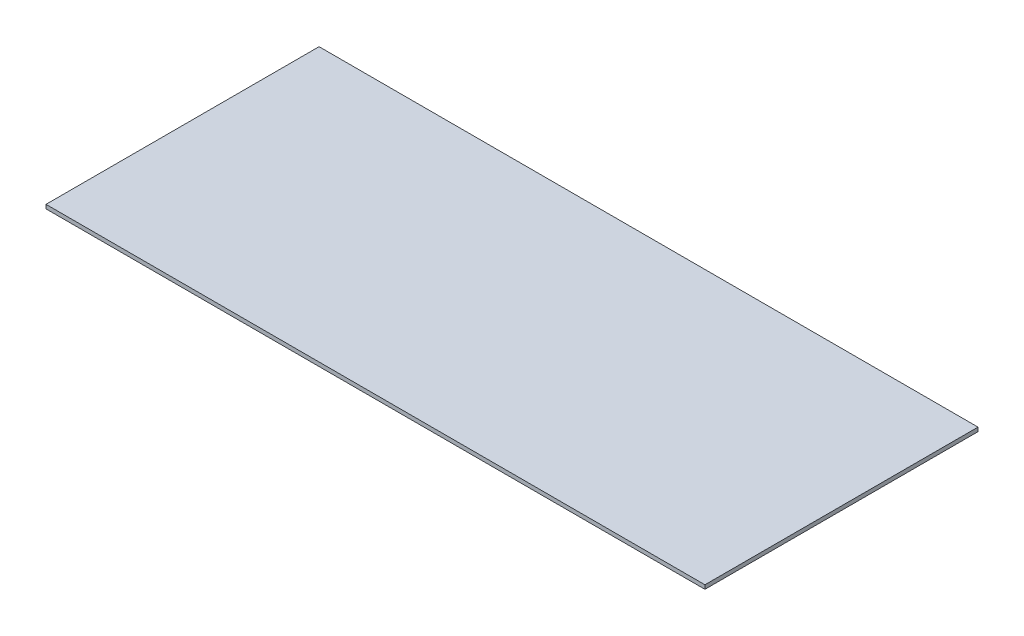
ISO-10303-21;
HEADER;
FILE_DESCRIPTION(('STEP AP214'),'2;1');
FILE_NAME('part.step','',(''),(''),'','','');
FILE_SCHEMA(('AUTOMOTIVE_DESIGN { 1 0 10303 214 1 1 1 1 }'));
ENDSEC;
DATA;
#1=APPLICATION_CONTEXT('core data for automotive mechanical design processes');
#2=APPLICATION_PROTOCOL_DEFINITION('international standard','automotive_design',2000,#1);
#3=PRODUCT_CONTEXT('',#1,'mechanical');
#4=PRODUCT('Part','Part','',(#3));
#5=PRODUCT_RELATED_PRODUCT_CATEGORY('part','',(#4));
#6=PRODUCT_DEFINITION_FORMATION('','',#4);
#7=PRODUCT_DEFINITION_CONTEXT('part definition',#1,'design');
#8=PRODUCT_DEFINITION('design','',#6,#7);
#9=PRODUCT_DEFINITION_SHAPE('','',#8);
#10=(LENGTH_UNIT() NAMED_UNIT(*) SI_UNIT(.MILLI.,.METRE.));
#11=(NAMED_UNIT(*) PLANE_ANGLE_UNIT() SI_UNIT($,.RADIAN.));
#12=(NAMED_UNIT(*) SI_UNIT($,.STERADIAN.) SOLID_ANGLE_UNIT());
#13=UNCERTAINTY_MEASURE_WITH_UNIT(LENGTH_MEASURE(1.E-05),#10,'distance_accuracy_value','');
#14=(GEOMETRIC_REPRESENTATION_CONTEXT(3) GLOBAL_UNCERTAINTY_ASSIGNED_CONTEXT((#13)) GLOBAL_UNIT_ASSIGNED_CONTEXT((#10,
#11,#12)) REPRESENTATION_CONTEXT('',''));
#15=CARTESIAN_POINT('',(0.,0.,0.));
#16=DIRECTION('',(0.,0.,1.));
#17=DIRECTION('',(1.,0.,0.));
#18=AXIS2_PLACEMENT_3D('',#15,#16,#17);
#19=CARTESIAN_POINT('',(0.,12.7,0.));
#20=DIRECTION('',(1.,0.,0.));
#21=DIRECTION('',(0.,0.,-1.));
#22=AXIS2_PLACEMENT_3D('',#19,#20,#21);
#23=PLANE('',#22);
#24=DIRECTION('',(0.,0.,1.));
#25=VECTOR('',#24,1.);
#26=CARTESIAN_POINT('',(0.,0.,0.));
#27=LINE('',#26,#25);
#28=CARTESIAN_POINT('',(0.,0.,-876.3));
#29=VERTEX_POINT('',#28);
#30=CARTESIAN_POINT('',(0.,0.,0.));
#31=VERTEX_POINT('',#30);
#32=EDGE_CURVE('E96',#29,#31,#27,.T.);
#33=ORIENTED_EDGE('',*,*,#32,.T.);
#34=DIRECTION('',(0.,-1.,0.));
#35=VECTOR('',#34,1.);
#36=CARTESIAN_POINT('',(0.,12.7,0.));
#37=LINE('',#36,#35);
#38=CARTESIAN_POINT('',(0.,12.7,0.));
#39=VERTEX_POINT('',#38);
#40=EDGE_CURVE('E11',#39,#31,#37,.T.);
#41=ORIENTED_EDGE('',*,*,#40,.F.);
#42=DIRECTION('',(0.,0.,1.));
#43=VECTOR('',#42,1.);
#44=CARTESIAN_POINT('',(0.,12.7,0.));
#45=LINE('',#44,#43);
#46=CARTESIAN_POINT('',(0.,12.7,-876.3));
#47=VERTEX_POINT('',#46);
#48=EDGE_CURVE('E84',#47,#39,#45,.T.);
#49=ORIENTED_EDGE('',*,*,#48,.F.);
#50=DIRECTION('',(0.,-1.,0.));
#51=VECTOR('',#50,1.);
#52=CARTESIAN_POINT('',(0.,12.7,-876.3));
#53=LINE('',#52,#51);
#54=EDGE_CURVE('E92',#47,#29,#53,.T.);
#55=ORIENTED_EDGE('',*,*,#54,.T.);
#56=EDGE_LOOP('',(#33,#41,#49,#55));
#57=FACE_BOUND('',#56,.T.);
#58=ADVANCED_FACE('F33',(#57),#23,.F.);
#59=CARTESIAN_POINT('',(0.,12.7,0.));
#60=DIRECTION('',(0.,0.,-1.));
#61=DIRECTION('',(-1.,0.,0.));
#62=AXIS2_PLACEMENT_3D('',#59,#60,#61);
#63=PLANE('',#62);
#64=DIRECTION('',(1.,0.,0.));
#65=VECTOR('',#64,1.);
#66=CARTESIAN_POINT('',(0.,0.,0.));
#67=LINE('',#66,#65);
#68=CARTESIAN_POINT('',(2114.55,0.,0.));
#69=VERTEX_POINT('',#68);
#70=EDGE_CURVE('E88',#31,#69,#67,.T.);
#71=ORIENTED_EDGE('',*,*,#70,.T.);
#72=DIRECTION('',(0.,-1.,0.));
#73=VECTOR('',#72,1.);
#74=CARTESIAN_POINT('',(2114.55,12.7,0.));
#75=LINE('',#74,#73);
#76=CARTESIAN_POINT('',(2114.55,12.7,0.));
#77=VERTEX_POINT('',#76);
#78=EDGE_CURVE('E41',#77,#69,#75,.T.);
#79=ORIENTED_EDGE('',*,*,#78,.F.);
#80=DIRECTION('',(1.,0.,0.));
#81=VECTOR('',#80,1.);
#82=CARTESIAN_POINT('',(0.,12.7,0.));
#83=LINE('',#82,#81);
#84=EDGE_CURVE('E79',#39,#77,#83,.T.);
#85=ORIENTED_EDGE('',*,*,#84,.F.);
#86=ORIENTED_EDGE('',*,*,#40,.T.);
#87=EDGE_LOOP('',(#71,#79,#85,#86));
#88=FACE_BOUND('',#87,.T.);
#89=ADVANCED_FACE('F87',(#88),#63,.F.);
#90=CARTESIAN_POINT('',(2114.55,12.7,0.));
#91=DIRECTION('',(-1.,0.,0.));
#92=DIRECTION('',(0.,0.,1.));
#93=AXIS2_PLACEMENT_3D('',#90,#91,#92);
#94=PLANE('',#93);
#95=DIRECTION('',(0.,0.,-1.));
#96=VECTOR('',#95,1.);
#97=CARTESIAN_POINT('',(2114.55,0.,0.));
#98=LINE('',#97,#96);
#99=CARTESIAN_POINT('',(2114.55,0.,-876.3));
#100=VERTEX_POINT('',#99);
#101=EDGE_CURVE('E66',#69,#100,#98,.T.);
#102=ORIENTED_EDGE('',*,*,#101,.T.);
#103=DIRECTION('',(0.,-1.,0.));
#104=VECTOR('',#103,1.);
#105=CARTESIAN_POINT('',(2114.55,12.7,-876.3));
#106=LINE('',#105,#104);
#107=CARTESIAN_POINT('',(2114.55,12.7,-876.3));
#108=VERTEX_POINT('',#107);
#109=EDGE_CURVE('E89',#108,#100,#106,.T.);
#110=ORIENTED_EDGE('',*,*,#109,.F.);
#111=DIRECTION('',(0.,0.,-1.));
#112=VECTOR('',#111,1.);
#113=CARTESIAN_POINT('',(2114.55,12.7,0.));
#114=LINE('',#113,#112);
#115=EDGE_CURVE('E82',#77,#108,#114,.T.);
#116=ORIENTED_EDGE('',*,*,#115,.F.);
#117=ORIENTED_EDGE('',*,*,#78,.T.);
#118=EDGE_LOOP('',(#102,#110,#116,#117));
#119=FACE_BOUND('',#118,.T.);
#120=ADVANCED_FACE('F90',(#119),#94,.F.);
#121=CARTESIAN_POINT('',(0.,12.7,-876.3));
#122=DIRECTION('',(0.,0.,1.));
#123=DIRECTION('',(1.,0.,0.));
#124=AXIS2_PLACEMENT_3D('',#121,#122,#123);
#125=PLANE('',#124);
#126=DIRECTION('',(-1.,0.,0.));
#127=VECTOR('',#126,1.);
#128=CARTESIAN_POINT('',(0.,0.,-876.3));
#129=LINE('',#128,#127);
#130=EDGE_CURVE('E72',#100,#29,#129,.T.);
#131=ORIENTED_EDGE('',*,*,#130,.T.);
#132=ORIENTED_EDGE('',*,*,#54,.F.);
#133=DIRECTION('',(-1.,0.,0.));
#134=VECTOR('',#133,1.);
#135=CARTESIAN_POINT('',(0.,12.7,-876.3));
#136=LINE('',#135,#134);
#137=EDGE_CURVE('E49',#108,#47,#136,.T.);
#138=ORIENTED_EDGE('',*,*,#137,.F.);
#139=ORIENTED_EDGE('',*,*,#109,.T.);
#140=EDGE_LOOP('',(#131,#132,#138,#139));
#141=FACE_BOUND('',#140,.T.);
#142=ADVANCED_FACE('F103',(#141),#125,.F.);
#143=CARTESIAN_POINT('',(0.,12.7,0.));
#144=DIRECTION('',(0.,-1.,0.));
#145=DIRECTION('',(0.,0.,-1.));
#146=AXIS2_PLACEMENT_3D('',#143,#144,#145);
#147=PLANE('',#146);
#148=ORIENTED_EDGE('',*,*,#48,.T.);
#149=ORIENTED_EDGE('',*,*,#84,.T.);
#150=ORIENTED_EDGE('',*,*,#115,.T.);
#151=ORIENTED_EDGE('',*,*,#137,.T.);
#152=EDGE_LOOP('',(#148,#149,#150,#151));
#153=FACE_BOUND('',#152,.T.);
#154=ADVANCED_FACE('F80',(#153),#147,.F.);
#155=CARTESIAN_POINT('',(0.,0.,0.));
#156=DIRECTION('',(0.,-1.,0.));
#157=DIRECTION('',(0.,0.,-1.));
#158=AXIS2_PLACEMENT_3D('',#155,#156,#157);
#159=PLANE('',#158);
#160=ORIENTED_EDGE('',*,*,#32,.F.);
#161=ORIENTED_EDGE('',*,*,#130,.F.);
#162=ORIENTED_EDGE('',*,*,#101,.F.);
#163=ORIENTED_EDGE('',*,*,#70,.F.);
#164=EDGE_LOOP('',(#160,#161,#162,#163));
#165=FACE_BOUND('',#164,.T.);
#166=ADVANCED_FACE('F106',(#165),#159,.T.);
#167=CLOSED_SHELL('',(#58,#89,#120,#142,#154,#166));
#168=MANIFOLD_SOLID_BREP('B2',#167);
#169=ADVANCED_BREP_SHAPE_REPRESENTATION('',(#18,#168),#14);
#170=SHAPE_DEFINITION_REPRESENTATION(#9,#169);
ENDSEC;
END-ISO-10303-21;
